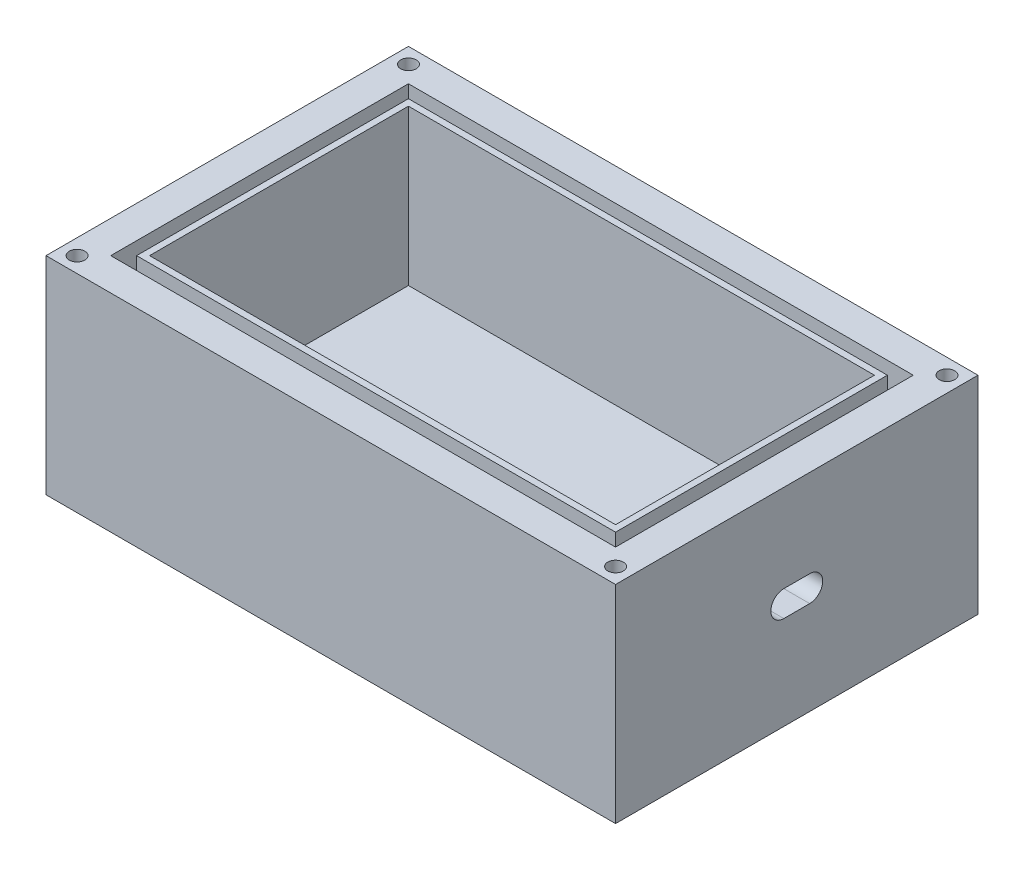
ISO-10303-21;
HEADER;
FILE_DESCRIPTION(('STEP AP214'),'2;1');
FILE_NAME('part.step','',(''),(''),'','','');
FILE_SCHEMA(('AUTOMOTIVE_DESIGN { 1 0 10303 214 1 1 1 1 }'));
ENDSEC;
DATA;
#1=APPLICATION_CONTEXT('core data for automotive mechanical design processes');
#2=APPLICATION_PROTOCOL_DEFINITION('international standard','automotive_design',2000,#1);
#3=PRODUCT_CONTEXT('',#1,'mechanical');
#4=PRODUCT('Part','Part','',(#3));
#5=PRODUCT_RELATED_PRODUCT_CATEGORY('part','',(#4));
#6=PRODUCT_DEFINITION_FORMATION('','',#4);
#7=PRODUCT_DEFINITION_CONTEXT('part definition',#1,'design');
#8=PRODUCT_DEFINITION('design','',#6,#7);
#9=PRODUCT_DEFINITION_SHAPE('','',#8);
#10=(LENGTH_UNIT() NAMED_UNIT(*) SI_UNIT(.MILLI.,.METRE.));
#11=(NAMED_UNIT(*) PLANE_ANGLE_UNIT() SI_UNIT($,.RADIAN.));
#12=(NAMED_UNIT(*) SI_UNIT($,.STERADIAN.) SOLID_ANGLE_UNIT());
#13=UNCERTAINTY_MEASURE_WITH_UNIT(LENGTH_MEASURE(1.E-05),#10,'distance_accuracy_value','');
#14=(GEOMETRIC_REPRESENTATION_CONTEXT(3) GLOBAL_UNCERTAINTY_ASSIGNED_CONTEXT((#13)) GLOBAL_UNIT_ASSIGNED_CONTEXT((#10,
#11,#12)) REPRESENTATION_CONTEXT('',''));
#15=CARTESIAN_POINT('',(0.,0.,0.));
#16=DIRECTION('',(0.,0.,1.));
#17=DIRECTION('',(1.,0.,0.));
#18=AXIS2_PLACEMENT_3D('',#15,#16,#17);
#19=CARTESIAN_POINT('',(69.85,50.8,-44.45));
#20=DIRECTION('',(-1.,0.,0.));
#21=DIRECTION('',(0.,0.,1.));
#22=AXIS2_PLACEMENT_3D('',#19,#20,#21);
#23=PLANE('',#22);
#24=DIRECTION('',(0.,0.,1.));
#25=VECTOR('',#24,1.);
#26=CARTESIAN_POINT('',(69.85,29.2767011982151,3.175));
#27=LINE('',#26,#25);
#28=CARTESIAN_POINT('',(69.85,29.2767011982151,-3.175));
#29=VERTEX_POINT('',#28);
#30=CARTESIAN_POINT('',(69.85,29.2767011982151,3.175));
#31=VERTEX_POINT('',#30);
#32=EDGE_CURVE('E185',#29,#31,#27,.T.);
#33=ORIENTED_EDGE('',*,*,#32,.F.);
#34=CARTESIAN_POINT('',(69.85,26.1017011982151,-3.175));
#35=DIRECTION('',(1.,0.,0.));
#36=DIRECTION('',(0.,0.,-1.));
#37=AXIS2_PLACEMENT_3D('',#34,#35,#36);
#38=CIRCLE('',#37,3.175);
#39=CARTESIAN_POINT('',(69.85,22.9267011982151,-3.175));
#40=VERTEX_POINT('',#39);
#41=EDGE_CURVE('E51',#40,#29,#38,.T.);
#42=ORIENTED_EDGE('',*,*,#41,.F.);
#43=DIRECTION('',(0.,0.,-1.));
#44=VECTOR('',#43,1.);
#45=CARTESIAN_POINT('',(69.85,22.9267011982151,3.175));
#46=LINE('',#45,#44);
#47=CARTESIAN_POINT('',(69.85,22.9267011982151,3.175));
#48=VERTEX_POINT('',#47);
#49=EDGE_CURVE('E191',#48,#40,#46,.T.);
#50=ORIENTED_EDGE('',*,*,#49,.F.);
#51=CARTESIAN_POINT('',(69.85,26.1017011982151,3.175));
#52=DIRECTION('',(1.,0.,0.));
#53=DIRECTION('',(0.,0.,-1.));
#54=AXIS2_PLACEMENT_3D('',#51,#52,#53);
#55=CIRCLE('',#54,3.175);
#56=EDGE_CURVE('E176',#31,#48,#55,.T.);
#57=ORIENTED_EDGE('',*,*,#56,.F.);
#58=EDGE_LOOP('',(#33,#42,#50,#57));
#59=FACE_BOUND('',#58,.T.);
#60=DIRECTION('',(0.,0.,-1.));
#61=VECTOR('',#60,1.);
#62=CARTESIAN_POINT('',(69.85,0.,-44.45));
#63=LINE('',#62,#61);
#64=CARTESIAN_POINT('',(69.85,0.,44.45));
#65=VERTEX_POINT('',#64);
#66=CARTESIAN_POINT('',(69.85,0.,-44.45));
#67=VERTEX_POINT('',#66);
#68=EDGE_CURVE('E318',#65,#67,#63,.T.);
#69=ORIENTED_EDGE('',*,*,#68,.T.);
#70=DIRECTION('',(0.,-1.,0.));
#71=VECTOR('',#70,1.);
#72=CARTESIAN_POINT('',(69.85,50.8,-44.45));
#73=LINE('',#72,#71);
#74=CARTESIAN_POINT('',(69.85,50.8,-44.45));
#75=VERTEX_POINT('',#74);
#76=EDGE_CURVE('E11',#75,#67,#73,.T.);
#77=ORIENTED_EDGE('',*,*,#76,.F.);
#78=DIRECTION('',(0.,0.,-1.));
#79=VECTOR('',#78,1.);
#80=CARTESIAN_POINT('',(69.85,50.8,-44.45));
#81=LINE('',#80,#79);
#82=CARTESIAN_POINT('',(69.85,50.8,44.45));
#83=VERTEX_POINT('',#82);
#84=EDGE_CURVE('E325',#83,#75,#81,.T.);
#85=ORIENTED_EDGE('',*,*,#84,.F.);
#86=DIRECTION('',(0.,-1.,0.));
#87=VECTOR('',#86,1.);
#88=CARTESIAN_POINT('',(69.85,50.8,44.45));
#89=LINE('',#88,#87);
#90=EDGE_CURVE('E335',#83,#65,#89,.T.);
#91=ORIENTED_EDGE('',*,*,#90,.T.);
#92=EDGE_LOOP('',(#69,#77,#85,#91));
#93=FACE_BOUND('',#92,.T.);
#94=ADVANCED_FACE('F37',(#59,#93),#23,.F.);
#95=CARTESIAN_POINT('',(-69.85,50.8,-44.45));
#96=DIRECTION('',(0.,0.,1.));
#97=DIRECTION('',(1.,0.,0.));
#98=AXIS2_PLACEMENT_3D('',#95,#96,#97);
#99=PLANE('',#98);
#100=DIRECTION('',(-1.,0.,0.));
#101=VECTOR('',#100,1.);
#102=CARTESIAN_POINT('',(-69.85,0.,-44.45));
#103=LINE('',#102,#101);
#104=CARTESIAN_POINT('',(-69.85,0.,-44.45));
#105=VERTEX_POINT('',#104);
#106=EDGE_CURVE('E338',#67,#105,#103,.T.);
#107=ORIENTED_EDGE('',*,*,#106,.T.);
#108=DIRECTION('',(0.,-1.,0.));
#109=VECTOR('',#108,1.);
#110=CARTESIAN_POINT('',(-69.85,50.8,-44.45));
#111=LINE('',#110,#109);
#112=CARTESIAN_POINT('',(-69.85,50.8,-44.45));
#113=VERTEX_POINT('',#112);
#114=EDGE_CURVE('E44',#113,#105,#111,.T.);
#115=ORIENTED_EDGE('',*,*,#114,.F.);
#116=DIRECTION('',(-1.,0.,0.));
#117=VECTOR('',#116,1.);
#118=CARTESIAN_POINT('',(-69.85,50.8,-44.45));
#119=LINE('',#118,#117);
#120=EDGE_CURVE('E328',#75,#113,#119,.T.);
#121=ORIENTED_EDGE('',*,*,#120,.F.);
#122=ORIENTED_EDGE('',*,*,#76,.T.);
#123=EDGE_LOOP('',(#107,#115,#121,#122));
#124=FACE_BOUND('',#123,.T.);
#125=ADVANCED_FACE('F367',(#124),#99,.F.);
#126=CARTESIAN_POINT('',(-69.85,50.8,-44.45));
#127=DIRECTION('',(1.,0.,0.));
#128=DIRECTION('',(0.,0.,-1.));
#129=AXIS2_PLACEMENT_3D('',#126,#127,#128);
#130=PLANE('',#129);
#131=DIRECTION('',(0.,0.,1.));
#132=VECTOR('',#131,1.);
#133=CARTESIAN_POINT('',(-69.85,0.,-44.45));
#134=LINE('',#133,#132);
#135=CARTESIAN_POINT('',(-69.8499999999999,0.,44.45));
#136=VERTEX_POINT('',#135);
#137=EDGE_CURVE('E340',#105,#136,#134,.T.);
#138=ORIENTED_EDGE('',*,*,#137,.T.);
#139=DIRECTION('',(0.,-1.,0.));
#140=VECTOR('',#139,1.);
#141=CARTESIAN_POINT('',(-69.8499999999999,50.8,44.45));
#142=LINE('',#141,#140);
#143=CARTESIAN_POINT('',(-69.8499999999999,50.8,44.45));
#144=VERTEX_POINT('',#143);
#145=EDGE_CURVE('E345',#144,#136,#142,.T.);
#146=ORIENTED_EDGE('',*,*,#145,.F.);
#147=DIRECTION('',(0.,0.,1.));
#148=VECTOR('',#147,1.);
#149=CARTESIAN_POINT('',(-69.85,50.8,-44.45));
#150=LINE('',#149,#148);
#151=EDGE_CURVE('E331',#113,#144,#150,.T.);
#152=ORIENTED_EDGE('',*,*,#151,.F.);
#153=ORIENTED_EDGE('',*,*,#114,.T.);
#154=EDGE_LOOP('',(#138,#146,#152,#153));
#155=FACE_BOUND('',#154,.T.);
#156=ADVANCED_FACE('F352',(#155),#130,.F.);
#157=CARTESIAN_POINT('',(-69.8499999999999,50.8,44.45));
#158=DIRECTION('',(0.,0.,-1.));
#159=DIRECTION('',(-1.,0.,0.));
#160=AXIS2_PLACEMENT_3D('',#157,#158,#159);
#161=PLANE('',#160);
#162=DIRECTION('',(1.,0.,0.));
#163=VECTOR('',#162,1.);
#164=CARTESIAN_POINT('',(-69.8499999999999,0.,44.45));
#165=LINE('',#164,#163);
#166=EDGE_CURVE('E329',#136,#65,#165,.T.);
#167=ORIENTED_EDGE('',*,*,#166,.T.);
#168=ORIENTED_EDGE('',*,*,#90,.F.);
#169=DIRECTION('',(1.,0.,0.));
#170=VECTOR('',#169,1.);
#171=CARTESIAN_POINT('',(-69.8499999999999,50.8,44.45));
#172=LINE('',#171,#170);
#173=EDGE_CURVE('E333',#144,#83,#172,.T.);
#174=ORIENTED_EDGE('',*,*,#173,.F.);
#175=ORIENTED_EDGE('',*,*,#145,.T.);
#176=EDGE_LOOP('',(#167,#168,#174,#175));
#177=FACE_BOUND('',#176,.T.);
#178=ADVANCED_FACE('F361',(#177),#161,.F.);
#179=CARTESIAN_POINT('',(0.,50.8,0.));
#180=DIRECTION('',(0.,1.,0.));
#181=DIRECTION('',(0.,0.,1.));
#182=AXIS2_PLACEMENT_3D('',#179,#180,#181);
#183=PLANE('',#182);
#184=CARTESIAN_POINT('',(-66.04,50.8,40.64));
#185=DIRECTION('',(0.,-1.,0.));
#186=DIRECTION('',(0.,0.,-1.));
#187=AXIS2_PLACEMENT_3D('',#184,#185,#186);
#188=CIRCLE('',#187,1.90500000000001);
#189=CARTESIAN_POINT('',(-66.04,50.8,38.735));
#190=VERTEX_POINT('',#189);
#191=EDGE_CURVE('E202',#190,#190,#188,.T.);
#192=ORIENTED_EDGE('',*,*,#191,.T.);
#193=EDGE_LOOP('',(#192));
#194=FACE_BOUND('',#193,.T.);
#195=CARTESIAN_POINT('',(66.04,50.8,40.64));
#196=DIRECTION('',(0.,1.,0.));
#197=DIRECTION('',(0.,0.,-1.));
#198=AXIS2_PLACEMENT_3D('',#195,#196,#197);
#199=CIRCLE('',#198,1.90500000000001);
#200=CARTESIAN_POINT('',(66.04,50.8,38.735));
#201=VERTEX_POINT('',#200);
#202=EDGE_CURVE('E207',#201,#201,#199,.T.);
#203=ORIENTED_EDGE('',*,*,#202,.F.);
#204=EDGE_LOOP('',(#203));
#205=FACE_BOUND('',#204,.T.);
#206=CARTESIAN_POINT('',(66.04,50.8,-40.64));
#207=DIRECTION('',(0.,-1.,0.));
#208=DIRECTION('',(0.,0.,1.));
#209=AXIS2_PLACEMENT_3D('',#206,#207,#208);
#210=CIRCLE('',#209,1.90500000000001);
#211=CARTESIAN_POINT('',(66.04,50.8,-38.735));
#212=VERTEX_POINT('',#211);
#213=EDGE_CURVE('E213',#212,#212,#210,.T.);
#214=ORIENTED_EDGE('',*,*,#213,.T.);
#215=EDGE_LOOP('',(#214));
#216=FACE_BOUND('',#215,.T.);
#217=CARTESIAN_POINT('',(-66.04,50.8,-40.64));
#218=DIRECTION('',(0.,1.,0.));
#219=DIRECTION('',(0.,0.,1.));
#220=AXIS2_PLACEMENT_3D('',#217,#218,#219);
#221=CIRCLE('',#220,1.90500000000001);
#222=CARTESIAN_POINT('',(-66.04,50.8,-38.735));
#223=VERTEX_POINT('',#222);
#224=EDGE_CURVE('E219',#223,#223,#221,.T.);
#225=ORIENTED_EDGE('',*,*,#224,.F.);
#226=EDGE_LOOP('',(#225));
#227=FACE_BOUND('',#226,.T.);
#228=DIRECTION('',(-1.,0.,0.));
#229=VECTOR('',#228,1.);
#230=CARTESIAN_POINT('',(61.9125,50.8,-36.5125));
#231=LINE('',#230,#229);
#232=CARTESIAN_POINT('',(61.9125,50.8,-36.5125));
#233=VERTEX_POINT('',#232);
#234=CARTESIAN_POINT('',(-61.9125,50.8,-36.5125));
#235=VERTEX_POINT('',#234);
#236=EDGE_CURVE('E254',#233,#235,#231,.T.);
#237=ORIENTED_EDGE('',*,*,#236,.F.);
#238=DIRECTION('',(0.,0.,-1.));
#239=VECTOR('',#238,1.);
#240=CARTESIAN_POINT('',(61.9125,50.8,36.5125));
#241=LINE('',#240,#239);
#242=CARTESIAN_POINT('',(61.9125,50.8,36.5125));
#243=VERTEX_POINT('',#242);
#244=EDGE_CURVE('E265',#243,#233,#241,.T.);
#245=ORIENTED_EDGE('',*,*,#244,.F.);
#246=DIRECTION('',(1.,0.,0.));
#247=VECTOR('',#246,1.);
#248=CARTESIAN_POINT('',(-61.9125,50.8,36.5125));
#249=LINE('',#248,#247);
#250=CARTESIAN_POINT('',(-61.9125,50.8,36.5125));
#251=VERTEX_POINT('',#250);
#252=EDGE_CURVE('E279',#251,#243,#249,.T.);
#253=ORIENTED_EDGE('',*,*,#252,.F.);
#254=DIRECTION('',(0.,0.,1.));
#255=VECTOR('',#254,1.);
#256=CARTESIAN_POINT('',(-61.9125,50.8,-36.5125));
#257=LINE('',#256,#255);
#258=EDGE_CURVE('E276',#235,#251,#257,.T.);
#259=ORIENTED_EDGE('',*,*,#258,.F.);
#260=EDGE_LOOP('',(#237,#245,#253,#259));
#261=FACE_BOUND('',#260,.T.);
#262=ORIENTED_EDGE('',*,*,#84,.T.);
#263=ORIENTED_EDGE('',*,*,#120,.T.);
#264=ORIENTED_EDGE('',*,*,#151,.T.);
#265=ORIENTED_EDGE('',*,*,#173,.T.);
#266=EDGE_LOOP('',(#262,#263,#264,#265));
#267=FACE_BOUND('',#266,.T.);
#268=ADVANCED_FACE('F366',(#194,#205,#216,#227,#261,#267),#183,.T.);
#269=CARTESIAN_POINT('',(0.,0.,0.));
#270=DIRECTION('',(0.,1.,0.));
#271=DIRECTION('',(0.,0.,1.));
#272=AXIS2_PLACEMENT_3D('',#269,#270,#271);
#273=PLANE('',#272);
#274=ORIENTED_EDGE('',*,*,#68,.F.);
#275=ORIENTED_EDGE('',*,*,#166,.F.);
#276=ORIENTED_EDGE('',*,*,#137,.F.);
#277=ORIENTED_EDGE('',*,*,#106,.F.);
#278=EDGE_LOOP('',(#274,#275,#276,#277));
#279=FACE_BOUND('',#278,.T.);
#280=ADVANCED_FACE('F358',(#279),#273,.F.);
#281=CARTESIAN_POINT('',(61.9125,44.45,-36.5125));
#282=DIRECTION('',(0.,0.,-1.));
#283=DIRECTION('',(-1.,0.,0.));
#284=AXIS2_PLACEMENT_3D('',#281,#282,#283);
#285=PLANE('',#284);
#286=ORIENTED_EDGE('',*,*,#236,.T.);
#287=DIRECTION('',(0.,1.,0.));
#288=VECTOR('',#287,1.);
#289=CARTESIAN_POINT('',(-61.9125,44.45,-36.5125));
#290=LINE('',#289,#288);
#291=CARTESIAN_POINT('',(-61.9125,44.45,-36.5125));
#292=VERTEX_POINT('',#291);
#293=EDGE_CURVE('E274',#292,#235,#290,.T.);
#294=ORIENTED_EDGE('',*,*,#293,.F.);
#295=DIRECTION('',(-1.,0.,0.));
#296=VECTOR('',#295,1.);
#297=CARTESIAN_POINT('',(61.9125,44.45,-36.5125));
#298=LINE('',#297,#296);
#299=CARTESIAN_POINT('',(61.9125,44.45,-36.5125));
#300=VERTEX_POINT('',#299);
#301=EDGE_CURVE('E261',#300,#292,#298,.T.);
#302=ORIENTED_EDGE('',*,*,#301,.F.);
#303=DIRECTION('',(0.,1.,0.));
#304=VECTOR('',#303,1.);
#305=CARTESIAN_POINT('',(61.9125,44.45,-36.5125));
#306=LINE('',#305,#304);
#307=EDGE_CURVE('E284',#300,#233,#306,.T.);
#308=ORIENTED_EDGE('',*,*,#307,.T.);
#309=EDGE_LOOP('',(#286,#294,#302,#308));
#310=FACE_BOUND('',#309,.T.);
#311=ADVANCED_FACE('F379',(#310),#285,.F.);
#312=CARTESIAN_POINT('',(61.9125,44.45,36.5125));
#313=DIRECTION('',(1.,0.,0.));
#314=DIRECTION('',(0.,0.,-1.));
#315=AXIS2_PLACEMENT_3D('',#312,#313,#314);
#316=PLANE('',#315);
#317=ORIENTED_EDGE('',*,*,#244,.T.);
#318=ORIENTED_EDGE('',*,*,#307,.F.);
#319=DIRECTION('',(0.,0.,-1.));
#320=VECTOR('',#319,1.);
#321=CARTESIAN_POINT('',(61.9125,44.45,36.5125));
#322=LINE('',#321,#320);
#323=CARTESIAN_POINT('',(61.9125,44.45,36.5125));
#324=VERTEX_POINT('',#323);
#325=EDGE_CURVE('E271',#324,#300,#322,.T.);
#326=ORIENTED_EDGE('',*,*,#325,.F.);
#327=DIRECTION('',(0.,1.,0.));
#328=VECTOR('',#327,1.);
#329=CARTESIAN_POINT('',(61.9125,44.45,36.5125));
#330=LINE('',#329,#328);
#331=EDGE_CURVE('E287',#324,#243,#330,.T.);
#332=ORIENTED_EDGE('',*,*,#331,.T.);
#333=EDGE_LOOP('',(#317,#318,#326,#332));
#334=FACE_BOUND('',#333,.T.);
#335=ADVANCED_FACE('F407',(#334),#316,.F.);
#336=CARTESIAN_POINT('',(-61.9125,44.45,36.5125));
#337=DIRECTION('',(0.,0.,1.));
#338=DIRECTION('',(1.,0.,0.));
#339=AXIS2_PLACEMENT_3D('',#336,#337,#338);
#340=PLANE('',#339);
#341=ORIENTED_EDGE('',*,*,#252,.T.);
#342=ORIENTED_EDGE('',*,*,#331,.F.);
#343=DIRECTION('',(1.,0.,0.));
#344=VECTOR('',#343,1.);
#345=CARTESIAN_POINT('',(-61.9125,44.45,36.5125));
#346=LINE('',#345,#344);
#347=CARTESIAN_POINT('',(-61.9125,44.45,36.5125));
#348=VERTEX_POINT('',#347);
#349=EDGE_CURVE('E268',#348,#324,#346,.T.);
#350=ORIENTED_EDGE('',*,*,#349,.F.);
#351=DIRECTION('',(0.,1.,0.));
#352=VECTOR('',#351,1.);
#353=CARTESIAN_POINT('',(-61.9125,44.45,36.5125));
#354=LINE('',#353,#352);
#355=EDGE_CURVE('E289',#348,#251,#354,.T.);
#356=ORIENTED_EDGE('',*,*,#355,.T.);
#357=EDGE_LOOP('',(#341,#342,#350,#356));
#358=FACE_BOUND('',#357,.T.);
#359=ADVANCED_FACE('F413',(#358),#340,.F.);
#360=CARTESIAN_POINT('',(-61.9125,44.45,-36.5125));
#361=DIRECTION('',(-1.,0.,0.));
#362=DIRECTION('',(0.,0.,1.));
#363=AXIS2_PLACEMENT_3D('',#360,#361,#362);
#364=PLANE('',#363);
#365=ORIENTED_EDGE('',*,*,#258,.T.);
#366=ORIENTED_EDGE('',*,*,#355,.F.);
#367=DIRECTION('',(0.,0.,1.));
#368=VECTOR('',#367,1.);
#369=CARTESIAN_POINT('',(-61.9125,44.45,-36.5125));
#370=LINE('',#369,#368);
#371=EDGE_CURVE('E264',#292,#348,#370,.T.);
#372=ORIENTED_EDGE('',*,*,#371,.F.);
#373=ORIENTED_EDGE('',*,*,#293,.T.);
#374=EDGE_LOOP('',(#365,#366,#372,#373));
#375=FACE_BOUND('',#374,.T.);
#376=ADVANCED_FACE('F409',(#375),#364,.F.);
#377=CARTESIAN_POINT('',(0.,44.45,0.));
#378=DIRECTION('',(0.,1.,0.));
#379=DIRECTION('',(0.,0.,1.));
#380=AXIS2_PLACEMENT_3D('',#377,#378,#379);
#381=PLANE('',#380);
#382=DIRECTION('',(0.,0.,-1.));
#383=VECTOR('',#382,1.);
#384=CARTESIAN_POINT('',(58.7375,44.45,33.3375));
#385=LINE('',#384,#383);
#386=CARTESIAN_POINT('',(58.7375,44.45,33.3375));
#387=VERTEX_POINT('',#386);
#388=CARTESIAN_POINT('',(58.7375,44.45,-33.3375));
#389=VERTEX_POINT('',#388);
#390=EDGE_CURVE('E238',#387,#389,#385,.T.);
#391=ORIENTED_EDGE('',*,*,#390,.F.);
#392=DIRECTION('',(1.,0.,0.));
#393=VECTOR('',#392,1.);
#394=CARTESIAN_POINT('',(-58.7375,44.45,33.3375));
#395=LINE('',#394,#393);
#396=CARTESIAN_POINT('',(-58.7375,44.45,33.3375));
#397=VERTEX_POINT('',#396);
#398=EDGE_CURVE('E235',#397,#387,#395,.T.);
#399=ORIENTED_EDGE('',*,*,#398,.F.);
#400=DIRECTION('',(0.,0.,1.));
#401=VECTOR('',#400,1.);
#402=CARTESIAN_POINT('',(-58.7375,44.45,-33.3375));
#403=LINE('',#402,#401);
#404=CARTESIAN_POINT('',(-58.7375,44.45,-33.3375));
#405=VERTEX_POINT('',#404);
#406=EDGE_CURVE('E231',#405,#397,#403,.T.);
#407=ORIENTED_EDGE('',*,*,#406,.F.);
#408=DIRECTION('',(-1.,0.,0.));
#409=VECTOR('',#408,1.);
#410=CARTESIAN_POINT('',(58.7375,44.45,-33.3375));
#411=LINE('',#410,#409);
#412=EDGE_CURVE('E228',#389,#405,#411,.T.);
#413=ORIENTED_EDGE('',*,*,#412,.F.);
#414=EDGE_LOOP('',(#391,#399,#407,#413));
#415=FACE_BOUND('',#414,.T.);
#416=ORIENTED_EDGE('',*,*,#301,.T.);
#417=ORIENTED_EDGE('',*,*,#371,.T.);
#418=ORIENTED_EDGE('',*,*,#349,.T.);
#419=ORIENTED_EDGE('',*,*,#325,.T.);
#420=EDGE_LOOP('',(#416,#417,#418,#419));
#421=FACE_BOUND('',#420,.T.);
#422=ADVANCED_FACE('F412',(#415,#421),#381,.T.);
#423=CARTESIAN_POINT('',(58.7375,44.45,-33.3375));
#424=DIRECTION('',(0.,0.,-1.));
#425=DIRECTION('',(-1.,0.,0.));
#426=AXIS2_PLACEMENT_3D('',#423,#424,#425);
#427=PLANE('',#426);
#428=DIRECTION('',(-1.,0.,0.));
#429=VECTOR('',#428,1.);
#430=CARTESIAN_POINT('',(58.7375,50.8,-33.3375));
#431=LINE('',#430,#429);
#432=CARTESIAN_POINT('',(58.7375,50.8,-33.3375));
#433=VERTEX_POINT('',#432);
#434=CARTESIAN_POINT('',(-58.7375,50.8,-33.3375));
#435=VERTEX_POINT('',#434);
#436=EDGE_CURVE('E225',#433,#435,#431,.T.);
#437=ORIENTED_EDGE('',*,*,#436,.F.);
#438=DIRECTION('',(0.,1.,0.));
#439=VECTOR('',#438,1.);
#440=CARTESIAN_POINT('',(58.7375,44.45,-33.3375));
#441=LINE('',#440,#439);
#442=EDGE_CURVE('E252',#389,#433,#441,.T.);
#443=ORIENTED_EDGE('',*,*,#442,.F.);
#444=ORIENTED_EDGE('',*,*,#412,.T.);
#445=DIRECTION('',(0.,1.,0.));
#446=VECTOR('',#445,1.);
#447=CARTESIAN_POINT('',(-58.7375,44.45,-33.3375));
#448=LINE('',#447,#446);
#449=EDGE_CURVE('E241',#405,#435,#448,.T.);
#450=ORIENTED_EDGE('',*,*,#449,.T.);
#451=EDGE_LOOP('',(#437,#443,#444,#450));
#452=FACE_BOUND('',#451,.T.);
#453=ADVANCED_FACE('F423',(#452),#427,.T.);
#454=CARTESIAN_POINT('',(58.7375,44.45,33.3375));
#455=DIRECTION('',(1.,0.,0.));
#456=DIRECTION('',(0.,0.,-1.));
#457=AXIS2_PLACEMENT_3D('',#454,#455,#456);
#458=PLANE('',#457);
#459=DIRECTION('',(0.,0.,-1.));
#460=VECTOR('',#459,1.);
#461=CARTESIAN_POINT('',(58.7375,50.8,33.3375));
#462=LINE('',#461,#460);
#463=CARTESIAN_POINT('',(58.7375,50.8,33.3375));
#464=VERTEX_POINT('',#463);
#465=EDGE_CURVE('E232',#464,#433,#462,.T.);
#466=ORIENTED_EDGE('',*,*,#465,.F.);
#467=DIRECTION('',(0.,1.,0.));
#468=VECTOR('',#467,1.);
#469=CARTESIAN_POINT('',(58.7375,44.45,33.3375));
#470=LINE('',#469,#468);
#471=EDGE_CURVE('E255',#387,#464,#470,.T.);
#472=ORIENTED_EDGE('',*,*,#471,.F.);
#473=ORIENTED_EDGE('',*,*,#390,.T.);
#474=ORIENTED_EDGE('',*,*,#442,.T.);
#475=EDGE_LOOP('',(#466,#472,#473,#474));
#476=FACE_BOUND('',#475,.T.);
#477=ADVANCED_FACE('F427',(#476),#458,.T.);
#478=CARTESIAN_POINT('',(-58.7375,44.45,33.3375));
#479=DIRECTION('',(0.,0.,1.));
#480=DIRECTION('',(1.,0.,0.));
#481=AXIS2_PLACEMENT_3D('',#478,#479,#480);
#482=PLANE('',#481);
#483=DIRECTION('',(1.,0.,0.));
#484=VECTOR('',#483,1.);
#485=CARTESIAN_POINT('',(-58.7375,50.8,33.3375));
#486=LINE('',#485,#484);
#487=CARTESIAN_POINT('',(-58.7375,50.8,33.3375));
#488=VERTEX_POINT('',#487);
#489=EDGE_CURVE('E247',#488,#464,#486,.T.);
#490=ORIENTED_EDGE('',*,*,#489,.F.);
#491=DIRECTION('',(0.,1.,0.));
#492=VECTOR('',#491,1.);
#493=CARTESIAN_POINT('',(-58.7375,44.45,33.3375));
#494=LINE('',#493,#492);
#495=EDGE_CURVE('E257',#397,#488,#494,.T.);
#496=ORIENTED_EDGE('',*,*,#495,.F.);
#497=ORIENTED_EDGE('',*,*,#398,.T.);
#498=ORIENTED_EDGE('',*,*,#471,.T.);
#499=EDGE_LOOP('',(#490,#496,#497,#498));
#500=FACE_BOUND('',#499,.T.);
#501=ADVANCED_FACE('F431',(#500),#482,.T.);
#502=CARTESIAN_POINT('',(-58.7375,44.45,-33.3375));
#503=DIRECTION('',(-1.,0.,0.));
#504=DIRECTION('',(0.,0.,1.));
#505=AXIS2_PLACEMENT_3D('',#502,#503,#504);
#506=PLANE('',#505);
#507=DIRECTION('',(0.,0.,1.));
#508=VECTOR('',#507,1.);
#509=CARTESIAN_POINT('',(-58.7375,50.8,-33.3375));
#510=LINE('',#509,#508);
#511=EDGE_CURVE('E244',#435,#488,#510,.T.);
#512=ORIENTED_EDGE('',*,*,#511,.F.);
#513=ORIENTED_EDGE('',*,*,#449,.F.);
#514=ORIENTED_EDGE('',*,*,#406,.T.);
#515=ORIENTED_EDGE('',*,*,#495,.T.);
#516=EDGE_LOOP('',(#512,#513,#514,#515));
#517=FACE_BOUND('',#516,.T.);
#518=ADVANCED_FACE('F403',(#517),#506,.T.);
#519=CARTESIAN_POINT('',(0.,12.7,0.));
#520=DIRECTION('',(0.,1.,0.));
#521=DIRECTION('',(0.,0.,1.));
#522=AXIS2_PLACEMENT_3D('',#519,#520,#521);
#523=PLANE('',#522);
#524=DIRECTION('',(0.,0.,-1.));
#525=VECTOR('',#524,1.);
#526=CARTESIAN_POINT('',(57.15,12.7,-31.75));
#527=LINE('',#526,#525);
#528=CARTESIAN_POINT('',(57.15,12.7,31.75));
#529=VERTEX_POINT('',#528);
#530=CARTESIAN_POINT('',(57.15,12.7,-31.75));
#531=VERTEX_POINT('',#530);
#532=EDGE_CURVE('E293',#529,#531,#527,.T.);
#533=ORIENTED_EDGE('',*,*,#532,.T.);
#534=DIRECTION('',(-1.,0.,0.));
#535=VECTOR('',#534,1.);
#536=CARTESIAN_POINT('',(-57.15,12.7,-31.75));
#537=LINE('',#536,#535);
#538=CARTESIAN_POINT('',(-57.15,12.7,-31.75));
#539=VERTEX_POINT('',#538);
#540=EDGE_CURVE('E296',#531,#539,#537,.T.);
#541=ORIENTED_EDGE('',*,*,#540,.T.);
#542=DIRECTION('',(0.,0.,1.));
#543=VECTOR('',#542,1.);
#544=CARTESIAN_POINT('',(-57.15,12.7,-31.75));
#545=LINE('',#544,#543);
#546=CARTESIAN_POINT('',(-57.15,12.7,31.75));
#547=VERTEX_POINT('',#546);
#548=EDGE_CURVE('E300',#539,#547,#545,.T.);
#549=ORIENTED_EDGE('',*,*,#548,.T.);
#550=DIRECTION('',(1.,0.,0.));
#551=VECTOR('',#550,1.);
#552=CARTESIAN_POINT('',(-57.15,12.7,31.75));
#553=LINE('',#552,#551);
#554=EDGE_CURVE('E303',#547,#529,#553,.T.);
#555=ORIENTED_EDGE('',*,*,#554,.T.);
#556=EDGE_LOOP('',(#533,#541,#549,#555));
#557=FACE_BOUND('',#556,.T.);
#558=ADVANCED_FACE('F393',(#557),#523,.T.);
#559=CARTESIAN_POINT('',(-57.15,12.7,-31.75));
#560=DIRECTION('',(0.,0.,-1.));
#561=DIRECTION('',(-1.,0.,0.));
#562=AXIS2_PLACEMENT_3D('',#559,#560,#561);
#563=PLANE('',#562);
#564=DIRECTION('',(-1.,0.,0.));
#565=VECTOR('',#564,1.);
#566=CARTESIAN_POINT('',(-57.15,50.8,-31.75));
#567=LINE('',#566,#565);
#568=CARTESIAN_POINT('',(57.15,50.8,-31.75));
#569=VERTEX_POINT('',#568);
#570=CARTESIAN_POINT('',(-57.15,50.8,-31.75));
#571=VERTEX_POINT('',#570);
#572=EDGE_CURVE('E308',#569,#571,#567,.T.);
#573=ORIENTED_EDGE('',*,*,#572,.T.);
#574=DIRECTION('',(0.,1.,0.));
#575=VECTOR('',#574,1.);
#576=CARTESIAN_POINT('',(-57.15,12.7,-31.75));
#577=LINE('',#576,#575);
#578=EDGE_CURVE('E321',#539,#571,#577,.T.);
#579=ORIENTED_EDGE('',*,*,#578,.F.);
#580=ORIENTED_EDGE('',*,*,#540,.F.);
#581=DIRECTION('',(0.,1.,0.));
#582=VECTOR('',#581,1.);
#583=CARTESIAN_POINT('',(57.15,12.7,-31.75));
#584=LINE('',#583,#582);
#585=EDGE_CURVE('E306',#531,#569,#584,.T.);
#586=ORIENTED_EDGE('',*,*,#585,.T.);
#587=EDGE_LOOP('',(#573,#579,#580,#586));
#588=FACE_BOUND('',#587,.T.);
#589=ADVANCED_FACE('F389',(#588),#563,.F.);
#590=CARTESIAN_POINT('',(-57.15,12.7,-31.75));
#591=DIRECTION('',(-1.,0.,0.));
#592=DIRECTION('',(0.,0.,1.));
#593=AXIS2_PLACEMENT_3D('',#590,#591,#592);
#594=PLANE('',#593);
#595=DIRECTION('',(0.,0.,1.));
#596=VECTOR('',#595,1.);
#597=CARTESIAN_POINT('',(-57.15,50.8,-31.75));
#598=LINE('',#597,#596);
#599=CARTESIAN_POINT('',(-57.15,50.8,31.75));
#600=VERTEX_POINT('',#599);
#601=EDGE_CURVE('E311',#571,#600,#598,.T.);
#602=ORIENTED_EDGE('',*,*,#601,.T.);
#603=DIRECTION('',(0.,1.,0.));
#604=VECTOR('',#603,1.);
#605=CARTESIAN_POINT('',(-57.15,12.7,31.75));
#606=LINE('',#605,#604);
#607=EDGE_CURVE('E319',#547,#600,#606,.T.);
#608=ORIENTED_EDGE('',*,*,#607,.F.);
#609=ORIENTED_EDGE('',*,*,#548,.F.);
#610=ORIENTED_EDGE('',*,*,#578,.T.);
#611=EDGE_LOOP('',(#602,#608,#609,#610));
#612=FACE_BOUND('',#611,.T.);
#613=ADVANCED_FACE('F392',(#612),#594,.F.);
#614=CARTESIAN_POINT('',(-57.15,12.7,31.75));
#615=DIRECTION('',(0.,0.,1.));
#616=DIRECTION('',(1.,0.,0.));
#617=AXIS2_PLACEMENT_3D('',#614,#615,#616);
#618=PLANE('',#617);
#619=DIRECTION('',(1.,0.,0.));
#620=VECTOR('',#619,1.);
#621=CARTESIAN_POINT('',(-57.15,50.8,31.75));
#622=LINE('',#621,#620);
#623=CARTESIAN_POINT('',(57.15,50.8,31.75));
#624=VERTEX_POINT('',#623);
#625=EDGE_CURVE('E297',#600,#624,#622,.T.);
#626=ORIENTED_EDGE('',*,*,#625,.T.);
#627=DIRECTION('',(0.,1.,0.));
#628=VECTOR('',#627,1.);
#629=CARTESIAN_POINT('',(57.15,12.7,31.75));
#630=LINE('',#629,#628);
#631=EDGE_CURVE('E316',#529,#624,#630,.T.);
#632=ORIENTED_EDGE('',*,*,#631,.F.);
#633=ORIENTED_EDGE('',*,*,#554,.F.);
#634=ORIENTED_EDGE('',*,*,#607,.T.);
#635=EDGE_LOOP('',(#626,#632,#633,#634));
#636=FACE_BOUND('',#635,.T.);
#637=ADVANCED_FACE('F387',(#636),#618,.F.);
#638=CARTESIAN_POINT('',(57.15,12.7,-31.75));
#639=DIRECTION('',(1.,0.,0.));
#640=DIRECTION('',(0.,0.,-1.));
#641=AXIS2_PLACEMENT_3D('',#638,#639,#640);
#642=PLANE('',#641);
#643=DIRECTION('',(0.,0.,1.));
#644=VECTOR('',#643,1.);
#645=CARTESIAN_POINT('',(57.15,22.9267011982151,3.175));
#646=LINE('',#645,#644);
#647=CARTESIAN_POINT('',(57.15,22.9267011982151,-3.175));
#648=VERTEX_POINT('',#647);
#649=CARTESIAN_POINT('',(57.15,22.9267011982151,3.175));
#650=VERTEX_POINT('',#649);
#651=EDGE_CURVE('E485',#648,#650,#646,.T.);
#652=ORIENTED_EDGE('',*,*,#651,.F.);
#653=CARTESIAN_POINT('',(57.15,26.1017011982151,-3.175));
#654=DIRECTION('',(1.,0.,0.));
#655=DIRECTION('',(0.,0.,-1.));
#656=AXIS2_PLACEMENT_3D('',#653,#654,#655);
#657=CIRCLE('',#656,3.175);
#658=CARTESIAN_POINT('',(57.15,29.2767011982151,-3.175));
#659=VERTEX_POINT('',#658);
#660=EDGE_CURVE('E203',#659,#648,#657,.F.);
#661=ORIENTED_EDGE('',*,*,#660,.F.);
#662=DIRECTION('',(0.,0.,-1.));
#663=VECTOR('',#662,1.);
#664=CARTESIAN_POINT('',(57.15,29.2767011982151,3.175));
#665=LINE('',#664,#663);
#666=CARTESIAN_POINT('',(57.15,29.2767011982151,3.175));
#667=VERTEX_POINT('',#666);
#668=EDGE_CURVE('E200',#667,#659,#665,.T.);
#669=ORIENTED_EDGE('',*,*,#668,.F.);
#670=CARTESIAN_POINT('',(57.15,26.1017011982151,3.175));
#671=DIRECTION('',(1.,0.,0.));
#672=DIRECTION('',(0.,0.,-1.));
#673=AXIS2_PLACEMENT_3D('',#670,#671,#672);
#674=CIRCLE('',#673,3.175);
#675=EDGE_CURVE('E179',#650,#667,#674,.F.);
#676=ORIENTED_EDGE('',*,*,#675,.F.);
#677=EDGE_LOOP('',(#652,#661,#669,#676));
#678=FACE_BOUND('',#677,.T.);
#679=DIRECTION('',(0.,0.,-1.));
#680=VECTOR('',#679,1.);
#681=CARTESIAN_POINT('',(57.15,50.8,-31.75));
#682=LINE('',#681,#680);
#683=EDGE_CURVE('E286',#624,#569,#682,.T.);
#684=ORIENTED_EDGE('',*,*,#683,.T.);
#685=ORIENTED_EDGE('',*,*,#585,.F.);
#686=ORIENTED_EDGE('',*,*,#532,.F.);
#687=ORIENTED_EDGE('',*,*,#631,.T.);
#688=EDGE_LOOP('',(#684,#685,#686,#687));
#689=FACE_BOUND('',#688,.T.);
#690=ADVANCED_FACE('F384',(#678,#689),#642,.F.);
#691=ORIENTED_EDGE('',*,*,#683,.F.);
#692=ORIENTED_EDGE('',*,*,#625,.F.);
#693=ORIENTED_EDGE('',*,*,#601,.F.);
#694=ORIENTED_EDGE('',*,*,#572,.F.);
#695=EDGE_LOOP('',(#691,#692,#693,#694));
#696=FACE_BOUND('',#695,.T.);
#697=ORIENTED_EDGE('',*,*,#465,.T.);
#698=ORIENTED_EDGE('',*,*,#436,.T.);
#699=ORIENTED_EDGE('',*,*,#511,.T.);
#700=ORIENTED_EDGE('',*,*,#489,.T.);
#701=EDGE_LOOP('',(#697,#698,#699,#700));
#702=FACE_BOUND('',#701,.T.);
#703=ADVANCED_FACE('F383',(#696,#702),#183,.T.);
#704=CARTESIAN_POINT('',(-66.04,38.1,-40.64));
#705=DIRECTION('',(0.,1.,0.));
#706=DIRECTION('',(0.,0.,1.));
#707=AXIS2_PLACEMENT_3D('',#704,#705,#706);
#708=CYLINDRICAL_SURFACE('',#707,1.90500000000001);
#709=CARTESIAN_POINT('',(-66.04,38.1,-40.64));
#710=DIRECTION('',(0.,1.,0.));
#711=DIRECTION('',(0.,0.,1.));
#712=AXIS2_PLACEMENT_3D('',#709,#710,#711);
#713=CIRCLE('',#712,1.90500000000001);
#714=CARTESIAN_POINT('',(-66.04,38.1,-38.735));
#715=VERTEX_POINT('',#714);
#716=EDGE_CURVE('E222',#715,#715,#713,.T.);
#717=ORIENTED_EDGE('',*,*,#716,.F.);
#718=EDGE_LOOP('',(#717));
#719=FACE_BOUND('',#718,.T.);
#720=ORIENTED_EDGE('',*,*,#224,.T.);
#721=EDGE_LOOP('',(#720));
#722=FACE_BOUND('',#721,.T.);
#723=ADVANCED_FACE('F439',(#719,#722),#708,.F.);
#724=CARTESIAN_POINT('',(-66.04,38.1,-40.64));
#725=DIRECTION('',(0.,1.,0.));
#726=DIRECTION('',(0.,0.,1.));
#727=AXIS2_PLACEMENT_3D('',#724,#725,#726);
#728=PLANE('',#727);
#729=ORIENTED_EDGE('',*,*,#716,.T.);
#730=EDGE_LOOP('',(#729));
#731=FACE_BOUND('',#730,.T.);
#732=ADVANCED_FACE('F442',(#731),#728,.T.);
#733=CARTESIAN_POINT('',(66.04,38.1,-40.64));
#734=DIRECTION('',(0.,1.,0.));
#735=DIRECTION('',(0.,0.,1.));
#736=AXIS2_PLACEMENT_3D('',#733,#734,#735);
#737=CYLINDRICAL_SURFACE('',#736,1.90500000000001);
#738=CARTESIAN_POINT('',(66.04,38.1,-40.64));
#739=DIRECTION('',(0.,-1.,0.));
#740=DIRECTION('',(0.,0.,1.));
#741=AXIS2_PLACEMENT_3D('',#738,#739,#740);
#742=CIRCLE('',#741,1.90500000000001);
#743=CARTESIAN_POINT('',(66.04,38.1,-38.735));
#744=VERTEX_POINT('',#743);
#745=EDGE_CURVE('E216',#744,#744,#742,.T.);
#746=ORIENTED_EDGE('',*,*,#745,.T.);
#747=EDGE_LOOP('',(#746));
#748=FACE_BOUND('',#747,.T.);
#749=ORIENTED_EDGE('',*,*,#213,.F.);
#750=EDGE_LOOP('',(#749));
#751=FACE_BOUND('',#750,.T.);
#752=ADVANCED_FACE('F446',(#748,#751),#737,.F.);
#753=CARTESIAN_POINT('',(66.04,38.1,-40.64));
#754=DIRECTION('',(0.,1.,0.));
#755=DIRECTION('',(0.,0.,1.));
#756=AXIS2_PLACEMENT_3D('',#753,#754,#755);
#757=PLANE('',#756);
#758=ORIENTED_EDGE('',*,*,#745,.F.);
#759=EDGE_LOOP('',(#758));
#760=FACE_BOUND('',#759,.T.);
#761=ADVANCED_FACE('F450',(#760),#757,.T.);
#762=CARTESIAN_POINT('',(66.04,38.1,40.64));
#763=DIRECTION('',(0.,1.,0.));
#764=DIRECTION('',(0.,0.,1.));
#765=AXIS2_PLACEMENT_3D('',#762,#763,#764);
#766=CYLINDRICAL_SURFACE('',#765,1.90500000000001);
#767=CARTESIAN_POINT('',(66.04,38.1,40.64));
#768=DIRECTION('',(0.,1.,0.));
#769=DIRECTION('',(0.,0.,-1.));
#770=AXIS2_PLACEMENT_3D('',#767,#768,#769);
#771=CIRCLE('',#770,1.90500000000001);
#772=CARTESIAN_POINT('',(66.04,38.1,38.735));
#773=VERTEX_POINT('',#772);
#774=EDGE_CURVE('E210',#773,#773,#771,.T.);
#775=ORIENTED_EDGE('',*,*,#774,.F.);
#776=EDGE_LOOP('',(#775));
#777=FACE_BOUND('',#776,.T.);
#778=ORIENTED_EDGE('',*,*,#202,.T.);
#779=EDGE_LOOP('',(#778));
#780=FACE_BOUND('',#779,.T.);
#781=ADVANCED_FACE('F454',(#777,#780),#766,.F.);
#782=CARTESIAN_POINT('',(66.04,38.1,40.64));
#783=DIRECTION('',(0.,1.,0.));
#784=DIRECTION('',(0.,0.,-1.));
#785=AXIS2_PLACEMENT_3D('',#782,#783,#784);
#786=PLANE('',#785);
#787=ORIENTED_EDGE('',*,*,#774,.T.);
#788=EDGE_LOOP('',(#787));
#789=FACE_BOUND('',#788,.T.);
#790=ADVANCED_FACE('F458',(#789),#786,.T.);
#791=CARTESIAN_POINT('',(-66.04,38.1,40.64));
#792=DIRECTION('',(0.,1.,0.));
#793=DIRECTION('',(0.,0.,1.));
#794=AXIS2_PLACEMENT_3D('',#791,#792,#793);
#795=CYLINDRICAL_SURFACE('',#794,1.90500000000001);
#796=CARTESIAN_POINT('',(-66.04,38.1,40.64));
#797=DIRECTION('',(0.,-1.,0.));
#798=DIRECTION('',(0.,0.,-1.));
#799=AXIS2_PLACEMENT_3D('',#796,#797,#798);
#800=CIRCLE('',#799,1.90500000000001);
#801=CARTESIAN_POINT('',(-66.04,38.1,38.735));
#802=VERTEX_POINT('',#801);
#803=EDGE_CURVE('E204',#802,#802,#800,.T.);
#804=ORIENTED_EDGE('',*,*,#803,.T.);
#805=EDGE_LOOP('',(#804));
#806=FACE_BOUND('',#805,.T.);
#807=ORIENTED_EDGE('',*,*,#191,.F.);
#808=EDGE_LOOP('',(#807));
#809=FACE_BOUND('',#808,.T.);
#810=ADVANCED_FACE('F462',(#806,#809),#795,.F.);
#811=CARTESIAN_POINT('',(-66.04,38.1,40.64));
#812=DIRECTION('',(0.,1.,0.));
#813=DIRECTION('',(0.,0.,-1.));
#814=AXIS2_PLACEMENT_3D('',#811,#812,#813);
#815=PLANE('',#814);
#816=ORIENTED_EDGE('',*,*,#803,.F.);
#817=EDGE_LOOP('',(#816));
#818=FACE_BOUND('',#817,.T.);
#819=ADVANCED_FACE('F466',(#818),#815,.T.);
#820=CARTESIAN_POINT('',(42.9509683428763,26.1017011982151,-3.175));
#821=DIRECTION('',(1.,0.,0.));
#822=DIRECTION('',(0.,0.,-1.));
#823=AXIS2_PLACEMENT_3D('',#820,#821,#822);
#824=CYLINDRICAL_SURFACE('',#823,3.175);
#825=ORIENTED_EDGE('',*,*,#660,.T.);
#826=DIRECTION('',(1.,0.,0.));
#827=VECTOR('',#826,1.);
#828=CARTESIAN_POINT('',(42.9509683428763,22.9267011982151,-3.175));
#829=LINE('',#828,#827);
#830=EDGE_CURVE('E196',#648,#40,#829,.T.);
#831=ORIENTED_EDGE('',*,*,#830,.T.);
#832=ORIENTED_EDGE('',*,*,#41,.T.);
#833=DIRECTION('',(1.,0.,0.));
#834=VECTOR('',#833,1.);
#835=CARTESIAN_POINT('',(42.9509683428763,29.2767011982151,-3.175));
#836=LINE('',#835,#834);
#837=EDGE_CURVE('E182',#659,#29,#836,.T.);
#838=ORIENTED_EDGE('',*,*,#837,.F.);
#839=EDGE_LOOP('',(#825,#831,#832,#838));
#840=FACE_BOUND('',#839,.T.);
#841=ADVANCED_FACE('F470',(#840),#824,.F.);
#842=CARTESIAN_POINT('',(42.9509683428763,22.9267011982151,3.175));
#843=DIRECTION('',(0.,-1.,0.));
#844=DIRECTION('',(0.,0.,-1.));
#845=AXIS2_PLACEMENT_3D('',#842,#843,#844);
#846=PLANE('',#845);
#847=ORIENTED_EDGE('',*,*,#651,.T.);
#848=DIRECTION('',(1.,0.,0.));
#849=VECTOR('',#848,1.);
#850=CARTESIAN_POINT('',(42.9509683428763,22.9267011982151,3.175));
#851=LINE('',#850,#849);
#852=EDGE_CURVE('E181',#650,#48,#851,.T.);
#853=ORIENTED_EDGE('',*,*,#852,.T.);
#854=ORIENTED_EDGE('',*,*,#49,.T.);
#855=ORIENTED_EDGE('',*,*,#830,.F.);
#856=EDGE_LOOP('',(#847,#853,#854,#855));
#857=FACE_BOUND('',#856,.T.);
#858=ADVANCED_FACE('F474',(#857),#846,.F.);
#859=CARTESIAN_POINT('',(42.9509683428763,26.1017011982151,3.175));
#860=DIRECTION('',(1.,0.,0.));
#861=DIRECTION('',(0.,0.,-1.));
#862=AXIS2_PLACEMENT_3D('',#859,#860,#861);
#863=CYLINDRICAL_SURFACE('',#862,3.175);
#864=ORIENTED_EDGE('',*,*,#675,.T.);
#865=DIRECTION('',(1.,0.,0.));
#866=VECTOR('',#865,1.);
#867=CARTESIAN_POINT('',(42.9509683428763,29.2767011982151,3.175));
#868=LINE('',#867,#866);
#869=EDGE_CURVE('E59',#667,#31,#868,.T.);
#870=ORIENTED_EDGE('',*,*,#869,.T.);
#871=ORIENTED_EDGE('',*,*,#56,.T.);
#872=ORIENTED_EDGE('',*,*,#852,.F.);
#873=EDGE_LOOP('',(#864,#870,#871,#872));
#874=FACE_BOUND('',#873,.T.);
#875=ADVANCED_FACE('F173',(#874),#863,.F.);
#876=CARTESIAN_POINT('',(42.9509683428763,29.2767011982151,3.175));
#877=DIRECTION('',(0.,1.,0.));
#878=DIRECTION('',(0.,0.,1.));
#879=AXIS2_PLACEMENT_3D('',#876,#877,#878);
#880=PLANE('',#879);
#881=ORIENTED_EDGE('',*,*,#668,.T.);
#882=ORIENTED_EDGE('',*,*,#837,.T.);
#883=ORIENTED_EDGE('',*,*,#32,.T.);
#884=ORIENTED_EDGE('',*,*,#869,.F.);
#885=EDGE_LOOP('',(#881,#882,#883,#884));
#886=FACE_BOUND('',#885,.T.);
#887=ADVANCED_FACE('F186',(#886),#880,.F.);
#888=CLOSED_SHELL('',(#94,#125,#156,#178,#268,#280,#311,#335,#359,#376,#422,#453,#477,#501,#518,
#558,#589,#613,#637,#690,#703,#723,#732,#752,#761,#781,#790,#810,#819,#841,#858,#875,#887));
#889=MANIFOLD_SOLID_BREP('B2',#888);
#890=ADVANCED_BREP_SHAPE_REPRESENTATION('',(#18,#889),#14);
#891=SHAPE_DEFINITION_REPRESENTATION(#9,#890);
ENDSEC;
END-ISO-10303-21;
